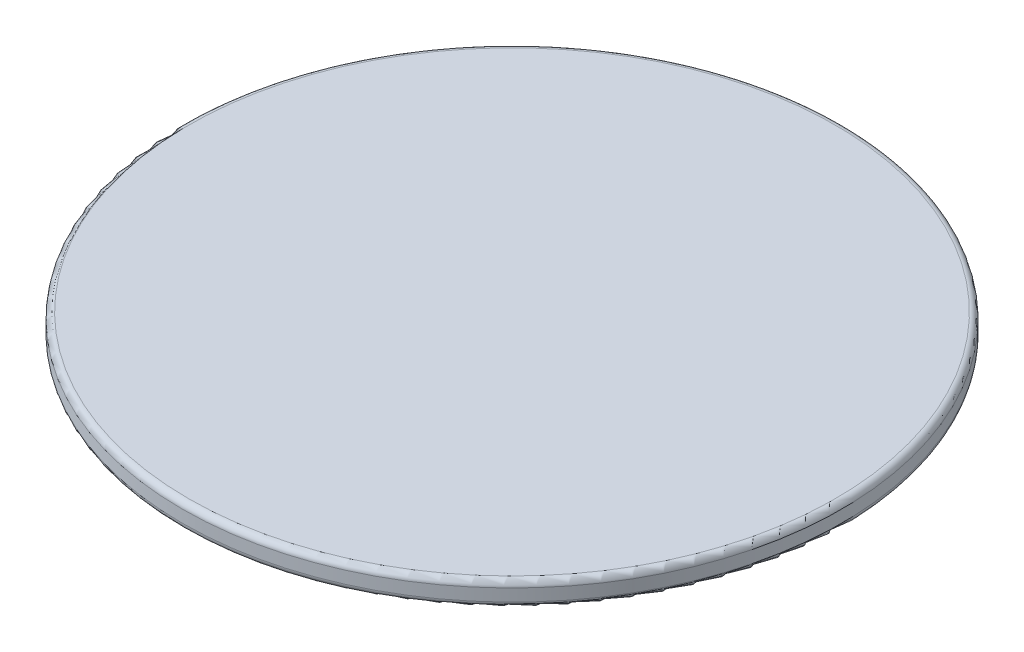
ISO-10303-21;
HEADER;
FILE_DESCRIPTION(('STEP AP214'),'2;1');
FILE_NAME('part.step','',(''),(''),'','','');
FILE_SCHEMA(('AUTOMOTIVE_DESIGN { 1 0 10303 214 1 1 1 1 }'));
ENDSEC;
DATA;
#1=APPLICATION_CONTEXT('core data for automotive mechanical design processes');
#2=APPLICATION_PROTOCOL_DEFINITION('international standard','automotive_design',2000,#1);
#3=PRODUCT_CONTEXT('',#1,'mechanical');
#4=PRODUCT('Part','Part','',(#3));
#5=PRODUCT_RELATED_PRODUCT_CATEGORY('part','',(#4));
#6=PRODUCT_DEFINITION_FORMATION('','',#4);
#7=PRODUCT_DEFINITION_CONTEXT('part definition',#1,'design');
#8=PRODUCT_DEFINITION('design','',#6,#7);
#9=PRODUCT_DEFINITION_SHAPE('','',#8);
#10=(LENGTH_UNIT() NAMED_UNIT(*) SI_UNIT(.MILLI.,.METRE.));
#11=(NAMED_UNIT(*) PLANE_ANGLE_UNIT() SI_UNIT($,.RADIAN.));
#12=(NAMED_UNIT(*) SI_UNIT($,.STERADIAN.) SOLID_ANGLE_UNIT());
#13=UNCERTAINTY_MEASURE_WITH_UNIT(LENGTH_MEASURE(1.E-05),#10,'distance_accuracy_value','');
#14=(GEOMETRIC_REPRESENTATION_CONTEXT(3) GLOBAL_UNCERTAINTY_ASSIGNED_CONTEXT((#13)) GLOBAL_UNIT_ASSIGNED_CONTEXT((#10,
#11,#12)) REPRESENTATION_CONTEXT('',''));
#15=CARTESIAN_POINT('',(0.,0.,0.));
#16=DIRECTION('',(0.,0.,1.));
#17=DIRECTION('',(1.,0.,0.));
#18=AXIS2_PLACEMENT_3D('',#15,#16,#17);
#19=CARTESIAN_POINT('',(0.,1.,0.));
#20=DIRECTION('',(0.,-1.,0.));
#21=DIRECTION('',(0.,0.,-1.));
#22=AXIS2_PLACEMENT_3D('',#19,#20,#21);
#23=CYLINDRICAL_SURFACE('',#22,13.5);
#24=CARTESIAN_POINT('',(0.,0.25,0.));
#25=DIRECTION('',(0.,1.,0.));
#26=DIRECTION('',(0.,0.,1.));
#27=AXIS2_PLACEMENT_3D('',#24,#25,#26);
#28=CIRCLE('',#27,13.5);
#29=CARTESIAN_POINT('',(0.,0.25,13.5));
#30=VERTEX_POINT('',#29);
#31=EDGE_CURVE('E41',#30,#30,#28,.T.);
#32=ORIENTED_EDGE('',*,*,#31,.T.);
#33=EDGE_LOOP('',(#32));
#34=FACE_BOUND('',#33,.T.);
#35=CARTESIAN_POINT('',(0.,0.75,0.));
#36=DIRECTION('',(0.,1.,0.));
#37=DIRECTION('',(0.,0.,1.));
#38=AXIS2_PLACEMENT_3D('',#35,#36,#37);
#39=CIRCLE('',#38,13.5);
#40=CARTESIAN_POINT('',(0.,0.75,13.5));
#41=VERTEX_POINT('',#40);
#42=EDGE_CURVE('E45',#41,#41,#39,.F.);
#43=ORIENTED_EDGE('',*,*,#42,.T.);
#44=EDGE_LOOP('',(#43));
#45=FACE_BOUND('',#44,.T.);
#46=ADVANCED_FACE('F30',(#34,#45),#23,.T.);
#47=CARTESIAN_POINT('',(0.,1.,0.));
#48=DIRECTION('',(0.,1.,0.));
#49=DIRECTION('',(0.,0.,1.));
#50=AXIS2_PLACEMENT_3D('',#47,#48,#49);
#51=PLANE('',#50);
#52=CARTESIAN_POINT('',(0.,1.,0.));
#53=DIRECTION('',(0.,1.,0.));
#54=DIRECTION('',(0.,0.,1.));
#55=AXIS2_PLACEMENT_3D('',#52,#53,#54);
#56=CIRCLE('',#55,13.25);
#57=CARTESIAN_POINT('',(0.,1.,13.25));
#58=VERTEX_POINT('',#57);
#59=EDGE_CURVE('E10',#58,#58,#56,.T.);
#60=ORIENTED_EDGE('',*,*,#59,.T.);
#61=EDGE_LOOP('',(#60));
#62=FACE_BOUND('',#61,.T.);
#63=ADVANCED_FACE('F61',(#62),#51,.T.);
#64=CARTESIAN_POINT('',(0.,0.,0.));
#65=DIRECTION('',(0.,1.,0.));
#66=DIRECTION('',(0.,0.,1.));
#67=AXIS2_PLACEMENT_3D('',#64,#65,#66);
#68=PLANE('',#67);
#69=CARTESIAN_POINT('',(0.,0.,0.));
#70=DIRECTION('',(0.,1.,0.));
#71=DIRECTION('',(0.,0.,1.));
#72=AXIS2_PLACEMENT_3D('',#69,#70,#71);
#73=CIRCLE('',#72,13.25);
#74=CARTESIAN_POINT('',(0.,0.,13.25));
#75=VERTEX_POINT('',#74);
#76=EDGE_CURVE('E37',#75,#75,#73,.F.);
#77=ORIENTED_EDGE('',*,*,#76,.T.);
#78=EDGE_LOOP('',(#77));
#79=FACE_BOUND('',#78,.T.);
#80=ADVANCED_FACE('F58',(#79),#68,.F.);
#81=CARTESIAN_POINT('',(0.,0.25,0.));
#82=DIRECTION('',(0.,1.,0.));
#83=DIRECTION('',(0.,0.,1.));
#84=AXIS2_PLACEMENT_3D('',#81,#82,#83);
#85=TOROIDAL_SURFACE('',#84,13.25,0.25);
#86=ORIENTED_EDGE('',*,*,#76,.F.);
#87=EDGE_LOOP('',(#86));
#88=FACE_BOUND('',#87,.T.);
#89=ORIENTED_EDGE('',*,*,#31,.F.);
#90=EDGE_LOOP('',(#89));
#91=FACE_BOUND('',#90,.T.);
#92=ADVANCED_FACE('F54',(#88,#91),#85,.T.);
#93=CARTESIAN_POINT('',(0.,0.75,0.));
#94=DIRECTION('',(0.,1.,0.));
#95=DIRECTION('',(0.,0.,1.));
#96=AXIS2_PLACEMENT_3D('',#93,#94,#95);
#97=TOROIDAL_SURFACE('',#96,13.25,0.25);
#98=ORIENTED_EDGE('',*,*,#42,.F.);
#99=EDGE_LOOP('',(#98));
#100=FACE_BOUND('',#99,.T.);
#101=ORIENTED_EDGE('',*,*,#59,.F.);
#102=EDGE_LOOP('',(#101));
#103=FACE_BOUND('',#102,.T.);
#104=ADVANCED_FACE('F32',(#100,#103),#97,.T.);
#105=CLOSED_SHELL('',(#46,#63,#80,#92,#104));
#106=MANIFOLD_SOLID_BREP('B2',#105);
#107=ADVANCED_BREP_SHAPE_REPRESENTATION('',(#18,#106),#14);
#108=SHAPE_DEFINITION_REPRESENTATION(#9,#107);
ENDSEC;
END-ISO-10303-21;
